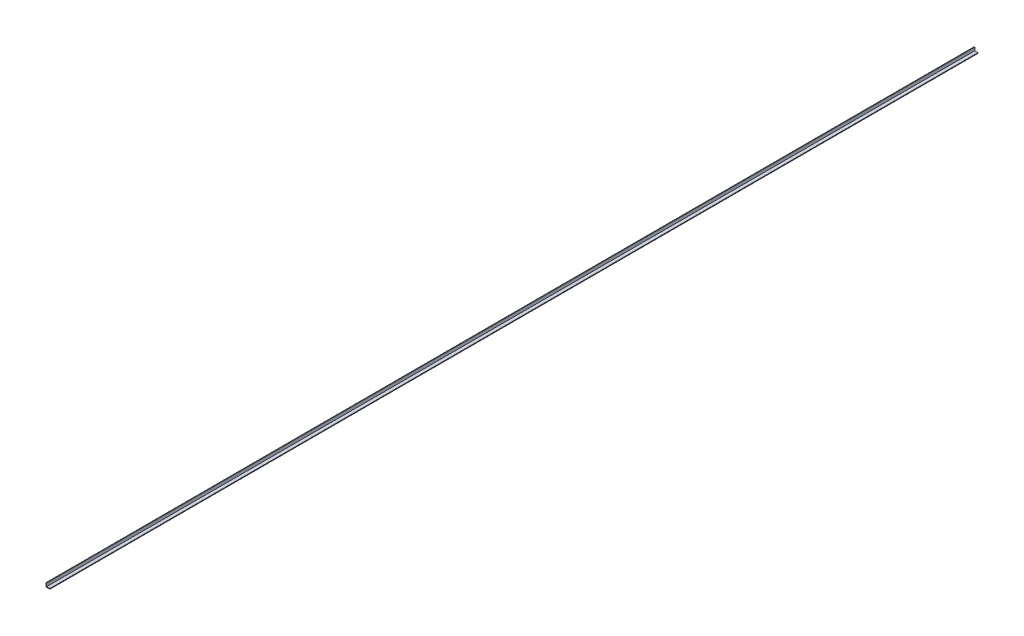
ISO-10303-21;
HEADER;
FILE_DESCRIPTION(('STEP AP214'),'2;1');
FILE_NAME('part.step','',(''),(''),'','','');
FILE_SCHEMA(('AUTOMOTIVE_DESIGN { 1 0 10303 214 1 1 1 1 }'));
ENDSEC;
DATA;
#1=APPLICATION_CONTEXT('core data for automotive mechanical design processes');
#2=APPLICATION_PROTOCOL_DEFINITION('international standard','automotive_design',2000,#1);
#3=PRODUCT_CONTEXT('',#1,'mechanical');
#4=PRODUCT('Part','Part','',(#3));
#5=PRODUCT_RELATED_PRODUCT_CATEGORY('part','',(#4));
#6=PRODUCT_DEFINITION_FORMATION('','',#4);
#7=PRODUCT_DEFINITION_CONTEXT('part definition',#1,'design');
#8=PRODUCT_DEFINITION('design','',#6,#7);
#9=PRODUCT_DEFINITION_SHAPE('','',#8);
#10=(LENGTH_UNIT() NAMED_UNIT(*) SI_UNIT(.MILLI.,.METRE.));
#11=(NAMED_UNIT(*) PLANE_ANGLE_UNIT() SI_UNIT($,.RADIAN.));
#12=(NAMED_UNIT(*) SI_UNIT($,.STERADIAN.) SOLID_ANGLE_UNIT());
#13=UNCERTAINTY_MEASURE_WITH_UNIT(LENGTH_MEASURE(1.E-05),#10,'distance_accuracy_value','');
#14=(GEOMETRIC_REPRESENTATION_CONTEXT(3) GLOBAL_UNCERTAINTY_ASSIGNED_CONTEXT((#13)) GLOBAL_UNIT_ASSIGNED_CONTEXT((#10,
#11,#12)) REPRESENTATION_CONTEXT('',''));
#15=CARTESIAN_POINT('',(0.,0.,0.));
#16=DIRECTION('',(0.,0.,1.));
#17=DIRECTION('',(1.,0.,0.));
#18=AXIS2_PLACEMENT_3D('',#15,#16,#17);
#19=CARTESIAN_POINT('',(4.76,25.4,-6100.));
#20=DIRECTION('',(0.,1.,0.));
#21=DIRECTION('',(0.,0.,1.));
#22=AXIS2_PLACEMENT_3D('',#19,#20,#21);
#23=PLANE('',#22);
#24=DIRECTION('',(-1.,0.,0.));
#25=VECTOR('',#24,1.);
#26=CARTESIAN_POINT('',(4.76,25.4,0.));
#27=LINE('',#26,#25);
#28=CARTESIAN_POINT('',(4.76,25.4,0.));
#29=VERTEX_POINT('',#28);
#30=CARTESIAN_POINT('',(0.,25.4,0.));
#31=VERTEX_POINT('',#30);
#32=EDGE_CURVE('E118',#29,#31,#27,.T.);
#33=ORIENTED_EDGE('',*,*,#32,.F.);
#34=DIRECTION('',(0.,0.,1.));
#35=VECTOR('',#34,1.);
#36=CARTESIAN_POINT('',(4.76,25.4,-6100.));
#37=LINE('',#36,#35);
#38=CARTESIAN_POINT('',(4.76,25.4,-6100.));
#39=VERTEX_POINT('',#38);
#40=EDGE_CURVE('E11',#39,#29,#37,.T.);
#41=ORIENTED_EDGE('',*,*,#40,.F.);
#42=DIRECTION('',(-1.,0.,0.));
#43=VECTOR('',#42,1.);
#44=CARTESIAN_POINT('',(4.76,25.4,-6100.));
#45=LINE('',#44,#43);
#46=CARTESIAN_POINT('',(0.,25.4,-6100.));
#47=VERTEX_POINT('',#46);
#48=EDGE_CURVE('E132',#39,#47,#45,.T.);
#49=ORIENTED_EDGE('',*,*,#48,.T.);
#50=DIRECTION('',(0.,0.,1.));
#51=VECTOR('',#50,1.);
#52=CARTESIAN_POINT('',(0.,25.4,-6100.));
#53=LINE('',#52,#51);
#54=EDGE_CURVE('E36',#47,#31,#53,.T.);
#55=ORIENTED_EDGE('',*,*,#54,.T.);
#56=EDGE_LOOP('',(#33,#41,#49,#55));
#57=FACE_BOUND('',#56,.T.);
#58=ADVANCED_FACE('F33',(#57),#23,.T.);
#59=CARTESIAN_POINT('',(4.76,4.76,-6100.));
#60=DIRECTION('',(1.,0.,0.));
#61=DIRECTION('',(0.,1.,0.));
#62=AXIS2_PLACEMENT_3D('',#59,#60,#61);
#63=PLANE('',#62);
#64=DIRECTION('',(0.,1.,0.));
#65=VECTOR('',#64,1.);
#66=CARTESIAN_POINT('',(4.76,4.76,0.));
#67=LINE('',#66,#65);
#68=CARTESIAN_POINT('',(4.76,4.76,0.));
#69=VERTEX_POINT('',#68);
#70=EDGE_CURVE('E130',#69,#29,#67,.T.);
#71=ORIENTED_EDGE('',*,*,#70,.F.);
#72=DIRECTION('',(0.,0.,1.));
#73=VECTOR('',#72,1.);
#74=CARTESIAN_POINT('',(4.76,4.76,-6100.));
#75=LINE('',#74,#73);
#76=CARTESIAN_POINT('',(4.76,4.76,-6100.));
#77=VERTEX_POINT('',#76);
#78=EDGE_CURVE('E42',#77,#69,#75,.T.);
#79=ORIENTED_EDGE('',*,*,#78,.F.);
#80=DIRECTION('',(0.,1.,0.));
#81=VECTOR('',#80,1.);
#82=CARTESIAN_POINT('',(4.76,4.76,-6100.));
#83=LINE('',#82,#81);
#84=EDGE_CURVE('E108',#77,#39,#83,.T.);
#85=ORIENTED_EDGE('',*,*,#84,.T.);
#86=ORIENTED_EDGE('',*,*,#40,.T.);
#87=EDGE_LOOP('',(#71,#79,#85,#86));
#88=FACE_BOUND('',#87,.T.);
#89=ADVANCED_FACE('F140',(#88),#63,.T.);
#90=CARTESIAN_POINT('',(25.4,4.76,-6100.));
#91=DIRECTION('',(0.,1.,0.));
#92=DIRECTION('',(-1.,0.,0.));
#93=AXIS2_PLACEMENT_3D('',#90,#91,#92);
#94=PLANE('',#93);
#95=DIRECTION('',(-1.,0.,0.));
#96=VECTOR('',#95,1.);
#97=CARTESIAN_POINT('',(25.4,4.76,0.));
#98=LINE('',#97,#96);
#99=CARTESIAN_POINT('',(25.4,4.76,0.));
#100=VERTEX_POINT('',#99);
#101=EDGE_CURVE('E95',#100,#69,#98,.T.);
#102=ORIENTED_EDGE('',*,*,#101,.F.);
#103=DIRECTION('',(0.,0.,1.));
#104=VECTOR('',#103,1.);
#105=CARTESIAN_POINT('',(25.4,4.76,-6100.));
#106=LINE('',#105,#104);
#107=CARTESIAN_POINT('',(25.4,4.76,-6100.));
#108=VERTEX_POINT('',#107);
#109=EDGE_CURVE('E90',#108,#100,#106,.T.);
#110=ORIENTED_EDGE('',*,*,#109,.F.);
#111=DIRECTION('',(-1.,0.,0.));
#112=VECTOR('',#111,1.);
#113=CARTESIAN_POINT('',(25.4,4.76,-6100.));
#114=LINE('',#113,#112);
#115=EDGE_CURVE('E93',#108,#77,#114,.T.);
#116=ORIENTED_EDGE('',*,*,#115,.T.);
#117=ORIENTED_EDGE('',*,*,#78,.T.);
#118=EDGE_LOOP('',(#102,#110,#116,#117));
#119=FACE_BOUND('',#118,.T.);
#120=ADVANCED_FACE('F92',(#119),#94,.T.);
#121=CARTESIAN_POINT('',(25.4,0.,-6100.));
#122=DIRECTION('',(1.,0.,0.));
#123=DIRECTION('',(0.,0.,-1.));
#124=AXIS2_PLACEMENT_3D('',#121,#122,#123);
#125=PLANE('',#124);
#126=DIRECTION('',(0.,1.,0.));
#127=VECTOR('',#126,1.);
#128=CARTESIAN_POINT('',(25.4,0.,0.));
#129=LINE('',#128,#127);
#130=CARTESIAN_POINT('',(25.4,0.,0.));
#131=VERTEX_POINT('',#130);
#132=EDGE_CURVE('E127',#131,#100,#129,.T.);
#133=ORIENTED_EDGE('',*,*,#132,.F.);
#134=DIRECTION('',(0.,0.,1.));
#135=VECTOR('',#134,1.);
#136=CARTESIAN_POINT('',(25.4,0.,-6100.));
#137=LINE('',#136,#135);
#138=CARTESIAN_POINT('',(25.4,0.,-6100.));
#139=VERTEX_POINT('',#138);
#140=EDGE_CURVE('E100',#139,#131,#137,.T.);
#141=ORIENTED_EDGE('',*,*,#140,.F.);
#142=DIRECTION('',(0.,1.,0.));
#143=VECTOR('',#142,1.);
#144=CARTESIAN_POINT('',(25.4,0.,-6100.));
#145=LINE('',#144,#143);
#146=EDGE_CURVE('E106',#139,#108,#145,.T.);
#147=ORIENTED_EDGE('',*,*,#146,.T.);
#148=ORIENTED_EDGE('',*,*,#109,.T.);
#149=EDGE_LOOP('',(#133,#141,#147,#148));
#150=FACE_BOUND('',#149,.T.);
#151=ADVANCED_FACE('F110',(#150),#125,.T.);
#152=CARTESIAN_POINT('',(0.,0.,-6100.));
#153=DIRECTION('',(0.,-1.,0.));
#154=DIRECTION('',(0.,0.,-1.));
#155=AXIS2_PLACEMENT_3D('',#152,#153,#154);
#156=PLANE('',#155);
#157=DIRECTION('',(1.,0.,0.));
#158=VECTOR('',#157,1.);
#159=CARTESIAN_POINT('',(0.,0.,0.));
#160=LINE('',#159,#158);
#161=CARTESIAN_POINT('',(0.,0.,0.));
#162=VERTEX_POINT('',#161);
#163=EDGE_CURVE('E124',#162,#131,#160,.T.);
#164=ORIENTED_EDGE('',*,*,#163,.F.);
#165=DIRECTION('',(0.,0.,1.));
#166=VECTOR('',#165,1.);
#167=CARTESIAN_POINT('',(0.,0.,-6100.));
#168=LINE('',#167,#166);
#169=CARTESIAN_POINT('',(0.,0.,-6100.));
#170=VERTEX_POINT('',#169);
#171=EDGE_CURVE('E135',#170,#162,#168,.T.);
#172=ORIENTED_EDGE('',*,*,#171,.F.);
#173=DIRECTION('',(1.,0.,0.));
#174=VECTOR('',#173,1.);
#175=CARTESIAN_POINT('',(0.,0.,-6100.));
#176=LINE('',#175,#174);
#177=EDGE_CURVE('E111',#170,#139,#176,.T.);
#178=ORIENTED_EDGE('',*,*,#177,.T.);
#179=ORIENTED_EDGE('',*,*,#140,.T.);
#180=EDGE_LOOP('',(#164,#172,#178,#179));
#181=FACE_BOUND('',#180,.T.);
#182=ADVANCED_FACE('F153',(#181),#156,.T.);
#183=CARTESIAN_POINT('',(0.,25.4,-6100.));
#184=DIRECTION('',(-1.,0.,0.));
#185=DIRECTION('',(0.,-1.,0.));
#186=AXIS2_PLACEMENT_3D('',#183,#184,#185);
#187=PLANE('',#186);
#188=DIRECTION('',(0.,-1.,0.));
#189=VECTOR('',#188,1.);
#190=CARTESIAN_POINT('',(0.,25.4,0.));
#191=LINE('',#190,#189);
#192=EDGE_CURVE('E121',#31,#162,#191,.T.);
#193=ORIENTED_EDGE('',*,*,#192,.F.);
#194=ORIENTED_EDGE('',*,*,#54,.F.);
#195=DIRECTION('',(0.,-1.,0.));
#196=VECTOR('',#195,1.);
#197=CARTESIAN_POINT('',(0.,25.4,-6100.));
#198=LINE('',#197,#196);
#199=EDGE_CURVE('E113',#47,#170,#198,.T.);
#200=ORIENTED_EDGE('',*,*,#199,.T.);
#201=ORIENTED_EDGE('',*,*,#171,.T.);
#202=EDGE_LOOP('',(#193,#194,#200,#201));
#203=FACE_BOUND('',#202,.T.);
#204=ADVANCED_FACE('F137',(#203),#187,.T.);
#205=CARTESIAN_POINT('',(0.,0.,-6100.));
#206=DIRECTION('',(0.,0.,1.));
#207=DIRECTION('',(1.,0.,0.));
#208=AXIS2_PLACEMENT_3D('',#205,#206,#207);
#209=PLANE('',#208);
#210=ORIENTED_EDGE('',*,*,#48,.F.);
#211=ORIENTED_EDGE('',*,*,#84,.F.);
#212=ORIENTED_EDGE('',*,*,#115,.F.);
#213=ORIENTED_EDGE('',*,*,#146,.F.);
#214=ORIENTED_EDGE('',*,*,#177,.F.);
#215=ORIENTED_EDGE('',*,*,#199,.F.);
#216=EDGE_LOOP('',(#210,#211,#212,#213,#214,#215));
#217=FACE_BOUND('',#216,.T.);
#218=ADVANCED_FACE('F104',(#217),#209,.F.);
#219=CARTESIAN_POINT('',(0.,0.,0.));
#220=DIRECTION('',(0.,0.,1.));
#221=DIRECTION('',(1.,0.,0.));
#222=AXIS2_PLACEMENT_3D('',#219,#220,#221);
#223=PLANE('',#222);
#224=ORIENTED_EDGE('',*,*,#32,.T.);
#225=ORIENTED_EDGE('',*,*,#192,.T.);
#226=ORIENTED_EDGE('',*,*,#163,.T.);
#227=ORIENTED_EDGE('',*,*,#132,.T.);
#228=ORIENTED_EDGE('',*,*,#101,.T.);
#229=ORIENTED_EDGE('',*,*,#70,.T.);
#230=EDGE_LOOP('',(#224,#225,#226,#227,#228,#229));
#231=FACE_BOUND('',#230,.T.);
#232=ADVANCED_FACE('F139',(#231),#223,.T.);
#233=CLOSED_SHELL('',(#58,#89,#120,#151,#182,#204,#218,#232));
#234=MANIFOLD_SOLID_BREP('B2',#233);
#235=ADVANCED_BREP_SHAPE_REPRESENTATION('',(#18,#234),#14);
#236=SHAPE_DEFINITION_REPRESENTATION(#9,#235);
ENDSEC;
END-ISO-10303-21;
